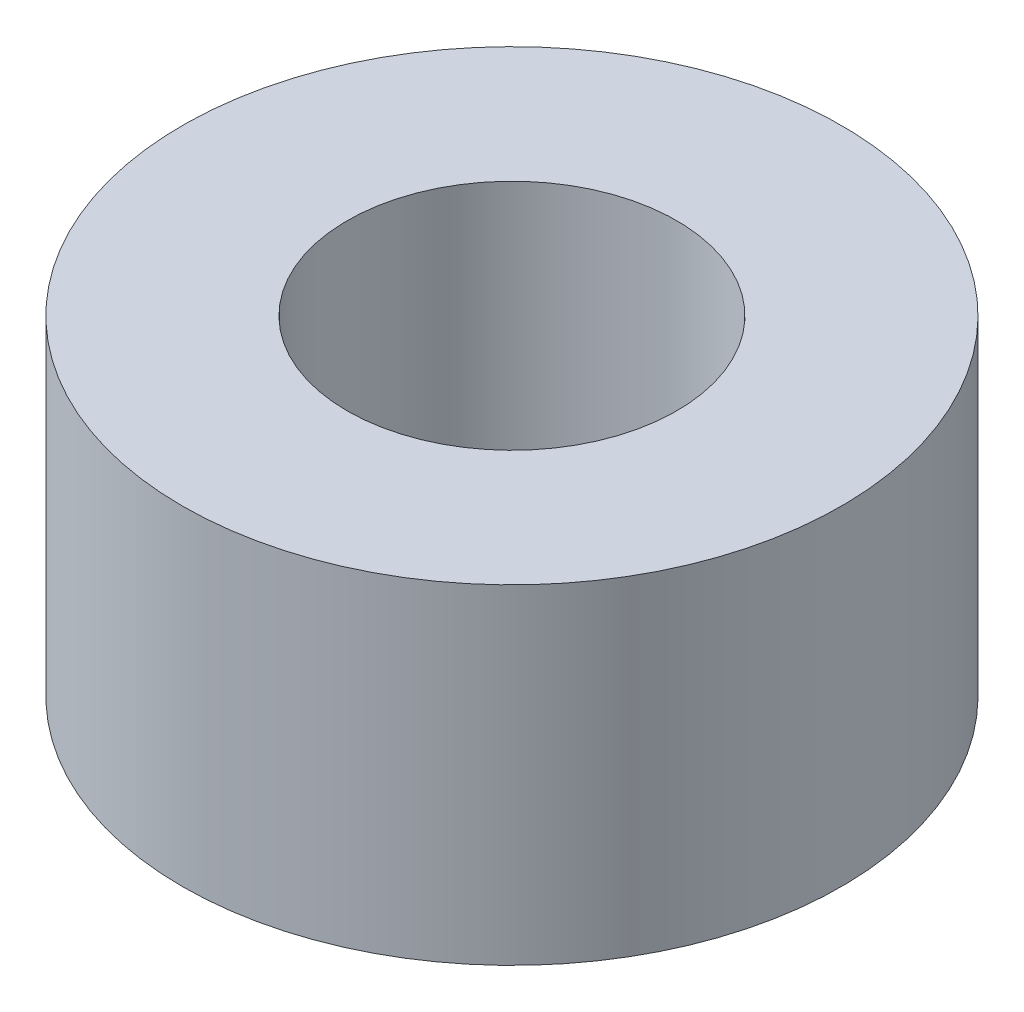
ISO-10303-21;
HEADER;
FILE_DESCRIPTION(('STEP AP214'),'2;1');
FILE_NAME('part.step','',(''),(''),'','','');
FILE_SCHEMA(('AUTOMOTIVE_DESIGN { 1 0 10303 214 1 1 1 1 }'));
ENDSEC;
DATA;
#1=APPLICATION_CONTEXT('core data for automotive mechanical design processes');
#2=APPLICATION_PROTOCOL_DEFINITION('international standard','automotive_design',2000,#1);
#3=PRODUCT_CONTEXT('',#1,'mechanical');
#4=PRODUCT('Part','Part','',(#3));
#5=PRODUCT_RELATED_PRODUCT_CATEGORY('part','',(#4));
#6=PRODUCT_DEFINITION_FORMATION('','',#4);
#7=PRODUCT_DEFINITION_CONTEXT('part definition',#1,'design');
#8=PRODUCT_DEFINITION('design','',#6,#7);
#9=PRODUCT_DEFINITION_SHAPE('','',#8);
#10=(LENGTH_UNIT() NAMED_UNIT(*) SI_UNIT(.MILLI.,.METRE.));
#11=(NAMED_UNIT(*) PLANE_ANGLE_UNIT() SI_UNIT($,.RADIAN.));
#12=(NAMED_UNIT(*) SI_UNIT($,.STERADIAN.) SOLID_ANGLE_UNIT());
#13=UNCERTAINTY_MEASURE_WITH_UNIT(LENGTH_MEASURE(1.E-05),#10,'distance_accuracy_value','');
#14=(GEOMETRIC_REPRESENTATION_CONTEXT(3) GLOBAL_UNCERTAINTY_ASSIGNED_CONTEXT((#13)) GLOBAL_UNIT_ASSIGNED_CONTEXT((#10,
#11,#12)) REPRESENTATION_CONTEXT('',''));
#15=CARTESIAN_POINT('',(0.,0.,0.));
#16=DIRECTION('',(0.,0.,1.));
#17=DIRECTION('',(1.,0.,0.));
#18=AXIS2_PLACEMENT_3D('',#15,#16,#17);
#19=CARTESIAN_POINT('',(0.,6.,0.));
#20=DIRECTION('',(0.,1.,0.));
#21=DIRECTION('',(0.,0.,1.));
#22=AXIS2_PLACEMENT_3D('',#19,#20,#21);
#23=PLANE('',#22);
#24=CARTESIAN_POINT('',(0.,6.,0.));
#25=DIRECTION('',(0.,1.,0.));
#26=DIRECTION('',(0.,0.,1.));
#27=AXIS2_PLACEMENT_3D('',#24,#25,#26);
#28=CIRCLE('',#27,6.);
#29=CARTESIAN_POINT('',(0.,6.,6.));
#30=VERTEX_POINT('',#29);
#31=EDGE_CURVE('E10',#30,#30,#28,.T.);
#32=ORIENTED_EDGE('',*,*,#31,.T.);
#33=EDGE_LOOP('',(#32));
#34=FACE_BOUND('',#33,.T.);
#35=CARTESIAN_POINT('',(0.,6.,0.));
#36=DIRECTION('',(0.,1.,0.));
#37=DIRECTION('',(0.,0.,1.));
#38=AXIS2_PLACEMENT_3D('',#35,#36,#37);
#39=CIRCLE('',#38,3.);
#40=CARTESIAN_POINT('',(0.,6.,3.));
#41=VERTEX_POINT('',#40);
#42=EDGE_CURVE('E48',#41,#41,#39,.T.);
#43=ORIENTED_EDGE('',*,*,#42,.F.);
#44=EDGE_LOOP('',(#43));
#45=FACE_BOUND('',#44,.T.);
#46=ADVANCED_FACE('F37',(#34,#45),#23,.T.);
#47=CARTESIAN_POINT('',(0.,0.,0.));
#48=DIRECTION('',(0.,1.,0.));
#49=DIRECTION('',(0.,0.,1.));
#50=AXIS2_PLACEMENT_3D('',#47,#48,#49);
#51=PLANE('',#50);
#52=CARTESIAN_POINT('',(0.,0.,0.));
#53=DIRECTION('',(0.,1.,0.));
#54=DIRECTION('',(0.,0.,1.));
#55=AXIS2_PLACEMENT_3D('',#52,#53,#54);
#56=CIRCLE('',#55,6.);
#57=CARTESIAN_POINT('',(0.,0.,6.));
#58=VERTEX_POINT('',#57);
#59=EDGE_CURVE('E41',#58,#58,#56,.T.);
#60=ORIENTED_EDGE('',*,*,#59,.F.);
#61=EDGE_LOOP('',(#60));
#62=FACE_BOUND('',#61,.T.);
#63=CARTESIAN_POINT('',(0.,0.,0.));
#64=DIRECTION('',(0.,1.,0.));
#65=DIRECTION('',(0.,0.,1.));
#66=AXIS2_PLACEMENT_3D('',#63,#64,#65);
#67=CIRCLE('',#66,3.);
#68=CARTESIAN_POINT('',(0.,0.,3.));
#69=VERTEX_POINT('',#68);
#70=EDGE_CURVE('E50',#69,#69,#67,.T.);
#71=ORIENTED_EDGE('',*,*,#70,.T.);
#72=EDGE_LOOP('',(#71));
#73=FACE_BOUND('',#72,.T.);
#74=ADVANCED_FACE('F60',(#62,#73),#51,.F.);
#75=CARTESIAN_POINT('',(0.,6.,0.));
#76=DIRECTION('',(0.,-1.,0.));
#77=DIRECTION('',(0.,0.,-1.));
#78=AXIS2_PLACEMENT_3D('',#75,#76,#77);
#79=CYLINDRICAL_SURFACE('',#78,6.);
#80=ORIENTED_EDGE('',*,*,#31,.F.);
#81=EDGE_LOOP('',(#80));
#82=FACE_BOUND('',#81,.T.);
#83=ORIENTED_EDGE('',*,*,#59,.T.);
#84=EDGE_LOOP('',(#83));
#85=FACE_BOUND('',#84,.T.);
#86=ADVANCED_FACE('F39',(#82,#85),#79,.T.);
#87=CARTESIAN_POINT('',(0.,6.,0.));
#88=DIRECTION('',(0.,-1.,0.));
#89=DIRECTION('',(0.,0.,-1.));
#90=AXIS2_PLACEMENT_3D('',#87,#88,#89);
#91=CYLINDRICAL_SURFACE('',#90,3.);
#92=ORIENTED_EDGE('',*,*,#42,.T.);
#93=EDGE_LOOP('',(#92));
#94=FACE_BOUND('',#93,.T.);
#95=ORIENTED_EDGE('',*,*,#70,.F.);
#96=EDGE_LOOP('',(#95));
#97=FACE_BOUND('',#96,.T.);
#98=ADVANCED_FACE('F56',(#94,#97),#91,.F.);
#99=CLOSED_SHELL('',(#46,#74,#86,#98));
#100=MANIFOLD_SOLID_BREP('B2',#99);
#101=ADVANCED_BREP_SHAPE_REPRESENTATION('',(#18,#100),#14);
#102=SHAPE_DEFINITION_REPRESENTATION(#9,#101);
ENDSEC;
END-ISO-10303-21;
